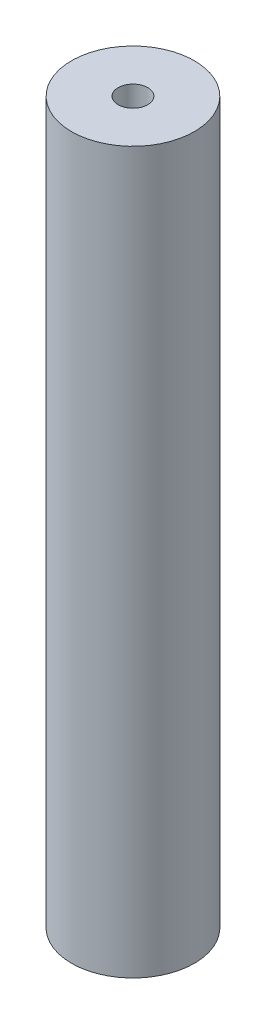
ISO-10303-21;
HEADER;
FILE_DESCRIPTION(('STEP AP214'),'2;1');
FILE_NAME('part.step','',(''),(''),'','','');
FILE_SCHEMA(('AUTOMOTIVE_DESIGN { 1 0 10303 214 1 1 1 1 }'));
ENDSEC;
DATA;
#1=APPLICATION_CONTEXT('core data for automotive mechanical design processes');
#2=APPLICATION_PROTOCOL_DEFINITION('international standard','automotive_design',2000,#1);
#3=PRODUCT_CONTEXT('',#1,'mechanical');
#4=PRODUCT('Part','Part','',(#3));
#5=PRODUCT_RELATED_PRODUCT_CATEGORY('part','',(#4));
#6=PRODUCT_DEFINITION_FORMATION('','',#4);
#7=PRODUCT_DEFINITION_CONTEXT('part definition',#1,'design');
#8=PRODUCT_DEFINITION('design','',#6,#7);
#9=PRODUCT_DEFINITION_SHAPE('','',#8);
#10=(LENGTH_UNIT() NAMED_UNIT(*) SI_UNIT(.MILLI.,.METRE.));
#11=(NAMED_UNIT(*) PLANE_ANGLE_UNIT() SI_UNIT($,.RADIAN.));
#12=(NAMED_UNIT(*) SI_UNIT($,.STERADIAN.) SOLID_ANGLE_UNIT());
#13=UNCERTAINTY_MEASURE_WITH_UNIT(LENGTH_MEASURE(1.E-05),#10,'distance_accuracy_value','');
#14=(GEOMETRIC_REPRESENTATION_CONTEXT(3) GLOBAL_UNCERTAINTY_ASSIGNED_CONTEXT((#13)) GLOBAL_UNIT_ASSIGNED_CONTEXT((#10,
#11,#12)) REPRESENTATION_CONTEXT('',''));
#15=CARTESIAN_POINT('',(0.,0.,0.));
#16=DIRECTION('',(0.,0.,1.));
#17=DIRECTION('',(1.,0.,0.));
#18=AXIS2_PLACEMENT_3D('',#15,#16,#17);
#19=CARTESIAN_POINT('',(0.,34.,0.));
#20=DIRECTION('',(0.,-1.,0.));
#21=DIRECTION('',(0.,0.,-1.));
#22=AXIS2_PLACEMENT_3D('',#19,#20,#21);
#23=CYLINDRICAL_SURFACE('',#22,2.9);
#24=CARTESIAN_POINT('',(0.,34.,0.));
#25=DIRECTION('',(0.,1.,0.));
#26=DIRECTION('',(0.,0.,1.));
#27=AXIS2_PLACEMENT_3D('',#24,#25,#26);
#28=CIRCLE('',#27,2.9);
#29=CARTESIAN_POINT('',(0.,34.,2.9));
#30=VERTEX_POINT('',#29);
#31=EDGE_CURVE('E10',#30,#30,#28,.T.);
#32=ORIENTED_EDGE('',*,*,#31,.F.);
#33=EDGE_LOOP('',(#32));
#34=FACE_BOUND('',#33,.T.);
#35=CARTESIAN_POINT('',(0.,0.,0.));
#36=DIRECTION('',(0.,1.,0.));
#37=DIRECTION('',(0.,0.,1.));
#38=AXIS2_PLACEMENT_3D('',#35,#36,#37);
#39=CIRCLE('',#38,2.9);
#40=CARTESIAN_POINT('',(0.,0.,2.9));
#41=VERTEX_POINT('',#40);
#42=EDGE_CURVE('E40',#41,#41,#39,.T.);
#43=ORIENTED_EDGE('',*,*,#42,.T.);
#44=EDGE_LOOP('',(#43));
#45=FACE_BOUND('',#44,.T.);
#46=ADVANCED_FACE('F37',(#34,#45),#23,.T.);
#47=CARTESIAN_POINT('',(0.,34.,0.));
#48=DIRECTION('',(0.,1.,0.));
#49=DIRECTION('',(0.,0.,1.));
#50=AXIS2_PLACEMENT_3D('',#47,#48,#49);
#51=PLANE('',#50);
#52=CARTESIAN_POINT('',(0.,34.,0.));
#53=DIRECTION('',(0.,1.,0.));
#54=DIRECTION('',(0.,0.,1.));
#55=AXIS2_PLACEMENT_3D('',#52,#53,#54);
#56=CIRCLE('',#55,0.7);
#57=CARTESIAN_POINT('',(0.,34.,0.7));
#58=VERTEX_POINT('',#57);
#59=EDGE_CURVE('E55',#58,#58,#56,.T.);
#60=ORIENTED_EDGE('',*,*,#59,.F.);
#61=EDGE_LOOP('',(#60));
#62=FACE_BOUND('',#61,.T.);
#63=ORIENTED_EDGE('',*,*,#31,.T.);
#64=EDGE_LOOP('',(#63));
#65=FACE_BOUND('',#64,.T.);
#66=ADVANCED_FACE('F70',(#62,#65),#51,.T.);
#67=CARTESIAN_POINT('',(0.,0.,0.));
#68=DIRECTION('',(0.,1.,0.));
#69=DIRECTION('',(0.,0.,1.));
#70=AXIS2_PLACEMENT_3D('',#67,#68,#69);
#71=PLANE('',#70);
#72=CARTESIAN_POINT('',(0.,0.,0.));
#73=DIRECTION('',(0.,1.,0.));
#74=DIRECTION('',(0.,0.,1.));
#75=AXIS2_PLACEMENT_3D('',#72,#73,#74);
#76=CIRCLE('',#75,0.7);
#77=CARTESIAN_POINT('',(0.,0.,0.7));
#78=VERTEX_POINT('',#77);
#79=EDGE_CURVE('E49',#78,#78,#76,.T.);
#80=ORIENTED_EDGE('',*,*,#79,.T.);
#81=EDGE_LOOP('',(#80));
#82=FACE_BOUND('',#81,.T.);
#83=ORIENTED_EDGE('',*,*,#42,.F.);
#84=EDGE_LOOP('',(#83));
#85=FACE_BOUND('',#84,.T.);
#86=ADVANCED_FACE('F72',(#82,#85),#71,.F.);
#87=CARTESIAN_POINT('',(0.,3.,0.));
#88=DIRECTION('',(0.,-1.,0.));
#89=DIRECTION('',(0.,0.,-1.));
#90=AXIS2_PLACEMENT_3D('',#87,#88,#89);
#91=CYLINDRICAL_SURFACE('',#90,0.7);
#92=CARTESIAN_POINT('',(0.,3.,0.));
#93=DIRECTION('',(0.,1.,0.));
#94=DIRECTION('',(0.,0.,1.));
#95=AXIS2_PLACEMENT_3D('',#92,#93,#94);
#96=CIRCLE('',#95,0.7);
#97=CARTESIAN_POINT('',(0.,3.,0.7));
#98=VERTEX_POINT('',#97);
#99=EDGE_CURVE('E47',#98,#98,#96,.T.);
#100=ORIENTED_EDGE('',*,*,#99,.T.);
#101=EDGE_LOOP('',(#100));
#102=FACE_BOUND('',#101,.T.);
#103=ORIENTED_EDGE('',*,*,#79,.F.);
#104=EDGE_LOOP('',(#103));
#105=FACE_BOUND('',#104,.T.);
#106=ADVANCED_FACE('F78',(#102,#105),#91,.F.);
#107=CARTESIAN_POINT('',(0.,3.,0.));
#108=DIRECTION('',(0.,1.,0.));
#109=DIRECTION('',(0.,0.,1.));
#110=AXIS2_PLACEMENT_3D('',#107,#108,#109);
#111=PLANE('',#110);
#112=ORIENTED_EDGE('',*,*,#99,.F.);
#113=EDGE_LOOP('',(#112));
#114=FACE_BOUND('',#113,.T.);
#115=ADVANCED_FACE('F66',(#114),#111,.F.);
#116=CARTESIAN_POINT('',(0.,31.,0.));
#117=DIRECTION('',(0.,1.,0.));
#118=DIRECTION('',(0.,0.,1.));
#119=AXIS2_PLACEMENT_3D('',#116,#117,#118);
#120=CYLINDRICAL_SURFACE('',#119,0.7);
#121=CARTESIAN_POINT('',(0.,31.,0.));
#122=DIRECTION('',(0.,1.,0.));
#123=DIRECTION('',(0.,0.,1.));
#124=AXIS2_PLACEMENT_3D('',#121,#122,#123);
#125=CIRCLE('',#124,0.7);
#126=CARTESIAN_POINT('',(0.,31.,0.7));
#127=VERTEX_POINT('',#126);
#128=EDGE_CURVE('E52',#127,#127,#125,.T.);
#129=ORIENTED_EDGE('',*,*,#128,.F.);
#130=EDGE_LOOP('',(#129));
#131=FACE_BOUND('',#130,.T.);
#132=ORIENTED_EDGE('',*,*,#59,.T.);
#133=EDGE_LOOP('',(#132));
#134=FACE_BOUND('',#133,.T.);
#135=ADVANCED_FACE('F63',(#131,#134),#120,.F.);
#136=CARTESIAN_POINT('',(0.,31.,0.));
#137=DIRECTION('',(0.,1.,0.));
#138=DIRECTION('',(0.,0.,1.));
#139=AXIS2_PLACEMENT_3D('',#136,#137,#138);
#140=PLANE('',#139);
#141=ORIENTED_EDGE('',*,*,#128,.T.);
#142=EDGE_LOOP('',(#141));
#143=FACE_BOUND('',#142,.T.);
#144=ADVANCED_FACE('F61',(#143),#140,.T.);
#145=CLOSED_SHELL('',(#46,#66,#86,#106,#115,#135,#144));
#146=MANIFOLD_SOLID_BREP('B2',#145);
#147=ADVANCED_BREP_SHAPE_REPRESENTATION('',(#18,#146),#14);
#148=SHAPE_DEFINITION_REPRESENTATION(#9,#147);
ENDSEC;
END-ISO-10303-21;
